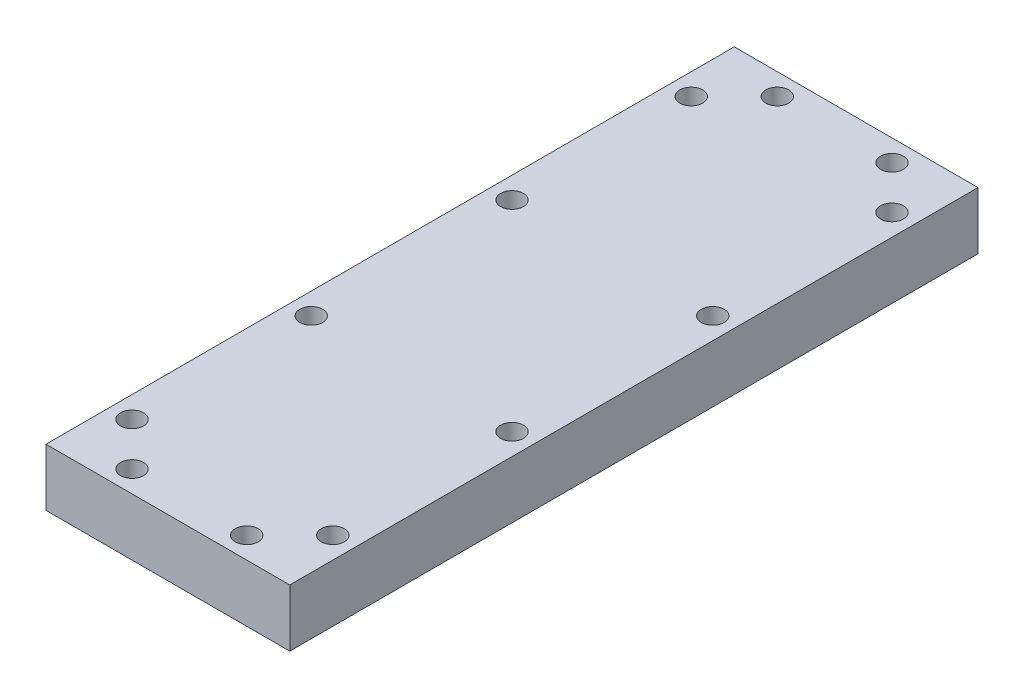
ISO-10303-21;
HEADER;
FILE_DESCRIPTION(('STEP AP214'),'2;1');
FILE_NAME('part.step','',(''),(''),'','','');
FILE_SCHEMA(('AUTOMOTIVE_DESIGN { 1 0 10303 214 1 1 1 1 }'));
ENDSEC;
DATA;
#1=APPLICATION_CONTEXT('core data for automotive mechanical design processes');
#2=APPLICATION_PROTOCOL_DEFINITION('international standard','automotive_design',2000,#1);
#3=PRODUCT_CONTEXT('',#1,'mechanical');
#4=PRODUCT('Part','Part','',(#3));
#5=PRODUCT_RELATED_PRODUCT_CATEGORY('part','',(#4));
#6=PRODUCT_DEFINITION_FORMATION('','',#4);
#7=PRODUCT_DEFINITION_CONTEXT('part definition',#1,'design');
#8=PRODUCT_DEFINITION('design','',#6,#7);
#9=PRODUCT_DEFINITION_SHAPE('','',#8);
#10=(LENGTH_UNIT() NAMED_UNIT(*) SI_UNIT(.MILLI.,.METRE.));
#11=(NAMED_UNIT(*) PLANE_ANGLE_UNIT() SI_UNIT($,.RADIAN.));
#12=(NAMED_UNIT(*) SI_UNIT($,.STERADIAN.) SOLID_ANGLE_UNIT());
#13=UNCERTAINTY_MEASURE_WITH_UNIT(LENGTH_MEASURE(1.E-05),#10,'distance_accuracy_value','');
#14=(GEOMETRIC_REPRESENTATION_CONTEXT(3) GLOBAL_UNCERTAINTY_ASSIGNED_CONTEXT((#13)) GLOBAL_UNIT_ASSIGNED_CONTEXT((#10,
#11,#12)) REPRESENTATION_CONTEXT('',''));
#15=CARTESIAN_POINT('',(0.,0.,0.));
#16=DIRECTION('',(0.,0.,1.));
#17=DIRECTION('',(1.,0.,0.));
#18=AXIS2_PLACEMENT_3D('',#15,#16,#17);
#19=CARTESIAN_POINT('',(-14.,0.,-34.));
#20=DIRECTION('',(0.,1.,0.));
#21=DIRECTION('',(-1.,0.,0.));
#22=AXIS2_PLACEMENT_3D('',#19,#20,#21);
#23=CYLINDRICAL_SURFACE('',#22,1.6);
#24=CARTESIAN_POINT('',(-14.,0.,-34.));
#25=DIRECTION('',(0.,1.,0.));
#26=DIRECTION('',(-1.,0.,0.));
#27=AXIS2_PLACEMENT_3D('',#24,#25,#26);
#28=CIRCLE('',#27,1.6);
#29=CARTESIAN_POINT('',(-12.4,0.,-34.));
#30=VERTEX_POINT('',#29);
#31=EDGE_CURVE('E221',#30,#30,#28,.T.);
#32=ORIENTED_EDGE('',*,*,#31,.F.);
#33=DIRECTION('',(0.,1.,0.));
#34=VECTOR('',#33,1.);
#35=CARTESIAN_POINT('',(-12.4,0.,-34.));
#36=LINE('',#35,#34);
#37=CARTESIAN_POINT('',(-12.4,8.,-34.));
#38=VERTEX_POINT('',#37);
#39=EDGE_CURVE('E11',#30,#38,#36,.T.);
#40=ORIENTED_EDGE('',*,*,#39,.T.);
#41=CARTESIAN_POINT('',(-14.,8.,-34.));
#42=DIRECTION('',(0.,1.,0.));
#43=DIRECTION('',(-1.,0.,0.));
#44=AXIS2_PLACEMENT_3D('',#41,#42,#43);
#45=CIRCLE('',#44,1.6);
#46=EDGE_CURVE('E21',#38,#38,#45,.T.);
#47=ORIENTED_EDGE('',*,*,#46,.T.);
#48=ORIENTED_EDGE('',*,*,#39,.F.);
#49=EDGE_LOOP('',(#32,#40,#47,#48));
#50=FACE_BOUND('',#49,.T.);
#51=ADVANCED_FACE('F17',(#50),#23,.F.);
#52=CARTESIAN_POINT('',(-14.,0.,-9.));
#53=DIRECTION('',(0.,1.,0.));
#54=DIRECTION('',(-1.,0.,0.));
#55=AXIS2_PLACEMENT_3D('',#52,#53,#54);
#56=CYLINDRICAL_SURFACE('',#55,1.6);
#57=CARTESIAN_POINT('',(-14.,0.,-9.));
#58=DIRECTION('',(0.,1.,0.));
#59=DIRECTION('',(-1.,0.,0.));
#60=AXIS2_PLACEMENT_3D('',#57,#58,#59);
#61=CIRCLE('',#60,1.6);
#62=CARTESIAN_POINT('',(-12.4,0.,-9.));
#63=VERTEX_POINT('',#62);
#64=EDGE_CURVE('E217',#63,#63,#61,.T.);
#65=ORIENTED_EDGE('',*,*,#64,.F.);
#66=DIRECTION('',(0.,1.,0.));
#67=VECTOR('',#66,1.);
#68=CARTESIAN_POINT('',(-12.4,0.,-9.));
#69=LINE('',#68,#67);
#70=CARTESIAN_POINT('',(-12.4,8.,-9.));
#71=VERTEX_POINT('',#70);
#72=EDGE_CURVE('E28',#63,#71,#69,.T.);
#73=ORIENTED_EDGE('',*,*,#72,.T.);
#74=CARTESIAN_POINT('',(-14.,8.,-9.));
#75=DIRECTION('',(0.,1.,0.));
#76=DIRECTION('',(-1.,0.,0.));
#77=AXIS2_PLACEMENT_3D('',#74,#75,#76);
#78=CIRCLE('',#77,1.6);
#79=EDGE_CURVE('E269',#71,#71,#78,.T.);
#80=ORIENTED_EDGE('',*,*,#79,.T.);
#81=ORIENTED_EDGE('',*,*,#72,.F.);
#82=EDGE_LOOP('',(#65,#73,#80,#81));
#83=FACE_BOUND('',#82,.T.);
#84=ADVANCED_FACE('F380',(#83),#56,.F.);
#85=CARTESIAN_POINT('',(14.,0.,-34.));
#86=DIRECTION('',(0.,1.,0.));
#87=DIRECTION('',(-1.,0.,0.));
#88=AXIS2_PLACEMENT_3D('',#85,#86,#87);
#89=CYLINDRICAL_SURFACE('',#88,1.6);
#90=CARTESIAN_POINT('',(14.,0.,-34.));
#91=DIRECTION('',(0.,1.,0.));
#92=DIRECTION('',(-1.,0.,0.));
#93=AXIS2_PLACEMENT_3D('',#90,#91,#92);
#94=CIRCLE('',#93,1.6);
#95=CARTESIAN_POINT('',(15.6,0.,-34.));
#96=VERTEX_POINT('',#95);
#97=EDGE_CURVE('E205',#96,#96,#94,.T.);
#98=ORIENTED_EDGE('',*,*,#97,.F.);
#99=DIRECTION('',(0.,1.,0.));
#100=VECTOR('',#99,1.);
#101=CARTESIAN_POINT('',(15.6,0.,-34.));
#102=LINE('',#101,#100);
#103=CARTESIAN_POINT('',(15.6,8.,-34.));
#104=VERTEX_POINT('',#103);
#105=EDGE_CURVE('E240',#96,#104,#102,.T.);
#106=ORIENTED_EDGE('',*,*,#105,.T.);
#107=CARTESIAN_POINT('',(14.,8.,-34.));
#108=DIRECTION('',(0.,1.,0.));
#109=DIRECTION('',(-1.,0.,0.));
#110=AXIS2_PLACEMENT_3D('',#107,#108,#109);
#111=CIRCLE('',#110,1.6);
#112=EDGE_CURVE('E265',#104,#104,#111,.T.);
#113=ORIENTED_EDGE('',*,*,#112,.T.);
#114=ORIENTED_EDGE('',*,*,#105,.F.);
#115=EDGE_LOOP('',(#98,#106,#113,#114));
#116=FACE_BOUND('',#115,.T.);
#117=ADVANCED_FACE('F385',(#116),#89,.F.);
#118=CARTESIAN_POINT('',(14.,0.,-9.));
#119=DIRECTION('',(0.,1.,0.));
#120=DIRECTION('',(-1.,0.,0.));
#121=AXIS2_PLACEMENT_3D('',#118,#119,#120);
#122=CYLINDRICAL_SURFACE('',#121,1.6);
#123=CARTESIAN_POINT('',(14.,0.,-9.));
#124=DIRECTION('',(0.,1.,0.));
#125=DIRECTION('',(-1.,0.,0.));
#126=AXIS2_PLACEMENT_3D('',#123,#124,#125);
#127=CIRCLE('',#126,1.6);
#128=CARTESIAN_POINT('',(15.6,0.,-9.));
#129=VERTEX_POINT('',#128);
#130=EDGE_CURVE('E196',#129,#129,#127,.T.);
#131=ORIENTED_EDGE('',*,*,#130,.F.);
#132=DIRECTION('',(0.,1.,0.));
#133=VECTOR('',#132,1.);
#134=CARTESIAN_POINT('',(15.6,0.,-9.));
#135=LINE('',#134,#133);
#136=CARTESIAN_POINT('',(15.6,8.,-9.));
#137=VERTEX_POINT('',#136);
#138=EDGE_CURVE('E189',#129,#137,#135,.T.);
#139=ORIENTED_EDGE('',*,*,#138,.T.);
#140=CARTESIAN_POINT('',(14.,8.,-9.));
#141=DIRECTION('',(0.,1.,0.));
#142=DIRECTION('',(-1.,0.,0.));
#143=AXIS2_PLACEMENT_3D('',#140,#141,#142);
#144=CIRCLE('',#143,1.6);
#145=EDGE_CURVE('E255',#137,#137,#144,.T.);
#146=ORIENTED_EDGE('',*,*,#145,.T.);
#147=ORIENTED_EDGE('',*,*,#138,.F.);
#148=EDGE_LOOP('',(#131,#139,#146,#147));
#149=FACE_BOUND('',#148,.T.);
#150=ADVANCED_FACE('F395',(#149),#122,.F.);
#151=CARTESIAN_POINT('',(-14.,0.,-62.));
#152=DIRECTION('',(0.,1.,0.));
#153=DIRECTION('',(-1.,0.,0.));
#154=AXIS2_PLACEMENT_3D('',#151,#152,#153);
#155=CYLINDRICAL_SURFACE('',#154,1.6);
#156=CARTESIAN_POINT('',(-14.,0.,-62.));
#157=DIRECTION('',(0.,1.,0.));
#158=DIRECTION('',(-1.,0.,0.));
#159=AXIS2_PLACEMENT_3D('',#156,#157,#158);
#160=CIRCLE('',#159,1.6);
#161=CARTESIAN_POINT('',(-12.4,0.,-62.));
#162=VERTEX_POINT('',#161);
#163=EDGE_CURVE('E185',#162,#162,#160,.T.);
#164=ORIENTED_EDGE('',*,*,#163,.F.);
#165=DIRECTION('',(0.,1.,0.));
#166=VECTOR('',#165,1.);
#167=CARTESIAN_POINT('',(-12.4,0.,-62.));
#168=LINE('',#167,#166);
#169=CARTESIAN_POINT('',(-12.4,8.,-62.));
#170=VERTEX_POINT('',#169);
#171=EDGE_CURVE('E182',#162,#170,#168,.T.);
#172=ORIENTED_EDGE('',*,*,#171,.T.);
#173=CARTESIAN_POINT('',(-14.,8.,-62.));
#174=DIRECTION('',(0.,1.,0.));
#175=DIRECTION('',(-1.,0.,0.));
#176=AXIS2_PLACEMENT_3D('',#173,#174,#175);
#177=CIRCLE('',#176,1.6);
#178=EDGE_CURVE('E187',#170,#170,#177,.T.);
#179=ORIENTED_EDGE('',*,*,#178,.T.);
#180=ORIENTED_EDGE('',*,*,#171,.F.);
#181=EDGE_LOOP('',(#164,#172,#179,#180));
#182=FACE_BOUND('',#181,.T.);
#183=ADVANCED_FACE('F184',(#182),#155,.F.);
#184=CARTESIAN_POINT('',(14.,0.,-62.));
#185=DIRECTION('',(0.,1.,0.));
#186=DIRECTION('',(-1.,0.,0.));
#187=AXIS2_PLACEMENT_3D('',#184,#185,#186);
#188=CYLINDRICAL_SURFACE('',#187,1.6);
#189=CARTESIAN_POINT('',(14.,0.,-62.));
#190=DIRECTION('',(0.,1.,0.));
#191=DIRECTION('',(-1.,0.,0.));
#192=AXIS2_PLACEMENT_3D('',#189,#190,#191);
#193=CIRCLE('',#192,1.6);
#194=CARTESIAN_POINT('',(15.6,0.,-62.));
#195=VERTEX_POINT('',#194);
#196=EDGE_CURVE('E197',#195,#195,#193,.T.);
#197=ORIENTED_EDGE('',*,*,#196,.F.);
#198=DIRECTION('',(0.,1.,0.));
#199=VECTOR('',#198,1.);
#200=CARTESIAN_POINT('',(15.6,0.,-62.));
#201=LINE('',#200,#199);
#202=CARTESIAN_POINT('',(15.6,8.,-62.));
#203=VERTEX_POINT('',#202);
#204=EDGE_CURVE('E190',#195,#203,#201,.T.);
#205=ORIENTED_EDGE('',*,*,#204,.T.);
#206=CARTESIAN_POINT('',(14.,8.,-62.));
#207=DIRECTION('',(0.,1.,0.));
#208=DIRECTION('',(-1.,0.,0.));
#209=AXIS2_PLACEMENT_3D('',#206,#207,#208);
#210=CIRCLE('',#209,1.6);
#211=EDGE_CURVE('E226',#203,#203,#210,.T.);
#212=ORIENTED_EDGE('',*,*,#211,.T.);
#213=ORIENTED_EDGE('',*,*,#204,.F.);
#214=EDGE_LOOP('',(#197,#205,#212,#213));
#215=FACE_BOUND('',#214,.T.);
#216=ADVANCED_FACE('F394',(#215),#188,.F.);
#217=CARTESIAN_POINT('',(-14.,0.,-87.));
#218=DIRECTION('',(0.,1.,0.));
#219=DIRECTION('',(-1.,0.,0.));
#220=AXIS2_PLACEMENT_3D('',#217,#218,#219);
#221=CYLINDRICAL_SURFACE('',#220,1.6);
#222=CARTESIAN_POINT('',(-14.,0.,-87.));
#223=DIRECTION('',(0.,1.,0.));
#224=DIRECTION('',(-1.,0.,0.));
#225=AXIS2_PLACEMENT_3D('',#222,#223,#224);
#226=CIRCLE('',#225,1.6);
#227=CARTESIAN_POINT('',(-12.4,0.,-87.));
#228=VERTEX_POINT('',#227);
#229=EDGE_CURVE('E208',#228,#228,#226,.T.);
#230=ORIENTED_EDGE('',*,*,#229,.F.);
#231=DIRECTION('',(0.,1.,0.));
#232=VECTOR('',#231,1.);
#233=CARTESIAN_POINT('',(-12.4,0.,-87.));
#234=LINE('',#233,#232);
#235=CARTESIAN_POINT('',(-12.4,8.,-87.));
#236=VERTEX_POINT('',#235);
#237=EDGE_CURVE('E228',#228,#236,#234,.T.);
#238=ORIENTED_EDGE('',*,*,#237,.T.);
#239=CARTESIAN_POINT('',(-14.,8.,-87.));
#240=DIRECTION('',(0.,1.,0.));
#241=DIRECTION('',(-1.,0.,0.));
#242=AXIS2_PLACEMENT_3D('',#239,#240,#241);
#243=CIRCLE('',#242,1.6);
#244=EDGE_CURVE('E222',#236,#236,#243,.T.);
#245=ORIENTED_EDGE('',*,*,#244,.T.);
#246=ORIENTED_EDGE('',*,*,#237,.F.);
#247=EDGE_LOOP('',(#230,#238,#245,#246));
#248=FACE_BOUND('',#247,.T.);
#249=ADVANCED_FACE('F403',(#248),#221,.F.);
#250=CARTESIAN_POINT('',(14.,0.,-87.));
#251=DIRECTION('',(0.,1.,0.));
#252=DIRECTION('',(-1.,0.,0.));
#253=AXIS2_PLACEMENT_3D('',#250,#251,#252);
#254=CYLINDRICAL_SURFACE('',#253,1.6);
#255=CARTESIAN_POINT('',(14.,0.,-87.));
#256=DIRECTION('',(0.,1.,0.));
#257=DIRECTION('',(-1.,0.,0.));
#258=AXIS2_PLACEMENT_3D('',#255,#256,#257);
#259=CIRCLE('',#258,1.6);
#260=CARTESIAN_POINT('',(15.6,0.,-87.));
#261=VERTEX_POINT('',#260);
#262=EDGE_CURVE('E252',#261,#261,#259,.T.);
#263=ORIENTED_EDGE('',*,*,#262,.F.);
#264=DIRECTION('',(0.,1.,0.));
#265=VECTOR('',#264,1.);
#266=CARTESIAN_POINT('',(15.6,0.,-87.));
#267=LINE('',#266,#265);
#268=CARTESIAN_POINT('',(15.6,8.,-87.));
#269=VERTEX_POINT('',#268);
#270=EDGE_CURVE('E230',#261,#269,#267,.T.);
#271=ORIENTED_EDGE('',*,*,#270,.T.);
#272=CARTESIAN_POINT('',(14.,8.,-87.));
#273=DIRECTION('',(0.,1.,0.));
#274=DIRECTION('',(-1.,0.,0.));
#275=AXIS2_PLACEMENT_3D('',#272,#273,#274);
#276=CIRCLE('',#275,1.6);
#277=EDGE_CURVE('E227',#269,#269,#276,.T.);
#278=ORIENTED_EDGE('',*,*,#277,.T.);
#279=ORIENTED_EDGE('',*,*,#270,.F.);
#280=EDGE_LOOP('',(#263,#271,#278,#279));
#281=FACE_BOUND('',#280,.T.);
#282=ADVANCED_FACE('F414',(#281),#254,.F.);
#283=CARTESIAN_POINT('',(-8.,0.,-3.));
#284=DIRECTION('',(0.,1.,0.));
#285=DIRECTION('',(-1.,0.,0.));
#286=AXIS2_PLACEMENT_3D('',#283,#284,#285);
#287=CYLINDRICAL_SURFACE('',#286,1.6);
#288=CARTESIAN_POINT('',(-8.,0.,-3.));
#289=DIRECTION('',(0.,1.,0.));
#290=DIRECTION('',(-1.,0.,0.));
#291=AXIS2_PLACEMENT_3D('',#288,#289,#290);
#292=CIRCLE('',#291,1.6);
#293=CARTESIAN_POINT('',(-6.4,0.,-3.));
#294=VERTEX_POINT('',#293);
#295=EDGE_CURVE('E296',#294,#294,#292,.T.);
#296=ORIENTED_EDGE('',*,*,#295,.F.);
#297=DIRECTION('',(0.,1.,0.));
#298=VECTOR('',#297,1.);
#299=CARTESIAN_POINT('',(-6.4,0.,-3.));
#300=LINE('',#299,#298);
#301=CARTESIAN_POINT('',(-6.4,8.,-3.));
#302=VERTEX_POINT('',#301);
#303=EDGE_CURVE('E85',#294,#302,#300,.T.);
#304=ORIENTED_EDGE('',*,*,#303,.T.);
#305=CARTESIAN_POINT('',(-8.,8.,-3.));
#306=DIRECTION('',(0.,1.,0.));
#307=DIRECTION('',(-1.,0.,0.));
#308=AXIS2_PLACEMENT_3D('',#305,#306,#307);
#309=CIRCLE('',#308,1.6);
#310=EDGE_CURVE('E318',#302,#302,#309,.T.);
#311=ORIENTED_EDGE('',*,*,#310,.T.);
#312=ORIENTED_EDGE('',*,*,#303,.F.);
#313=EDGE_LOOP('',(#296,#304,#311,#312));
#314=FACE_BOUND('',#313,.T.);
#315=ADVANCED_FACE('F417',(#314),#287,.F.);
#316=CARTESIAN_POINT('',(8.,0.,-3.));
#317=DIRECTION('',(0.,1.,0.));
#318=DIRECTION('',(-1.,0.,0.));
#319=AXIS2_PLACEMENT_3D('',#316,#317,#318);
#320=CYLINDRICAL_SURFACE('',#319,1.6);
#321=CARTESIAN_POINT('',(8.,0.,-3.));
#322=DIRECTION('',(0.,1.,0.));
#323=DIRECTION('',(-1.,0.,0.));
#324=AXIS2_PLACEMENT_3D('',#321,#322,#323);
#325=CIRCLE('',#324,1.6);
#326=CARTESIAN_POINT('',(9.6,0.,-3.));
#327=VERTEX_POINT('',#326);
#328=EDGE_CURVE('E310',#327,#327,#325,.T.);
#329=ORIENTED_EDGE('',*,*,#328,.F.);
#330=DIRECTION('',(0.,1.,0.));
#331=VECTOR('',#330,1.);
#332=CARTESIAN_POINT('',(9.6,0.,-3.));
#333=LINE('',#332,#331);
#334=CARTESIAN_POINT('',(9.6,8.,-3.));
#335=VERTEX_POINT('',#334);
#336=EDGE_CURVE('E99',#327,#335,#333,.T.);
#337=ORIENTED_EDGE('',*,*,#336,.T.);
#338=CARTESIAN_POINT('',(8.,8.,-3.));
#339=DIRECTION('',(0.,1.,0.));
#340=DIRECTION('',(-1.,0.,0.));
#341=AXIS2_PLACEMENT_3D('',#338,#339,#340);
#342=CIRCLE('',#341,1.6);
#343=EDGE_CURVE('E302',#335,#335,#342,.T.);
#344=ORIENTED_EDGE('',*,*,#343,.T.);
#345=ORIENTED_EDGE('',*,*,#336,.F.);
#346=EDGE_LOOP('',(#329,#337,#344,#345));
#347=FACE_BOUND('',#346,.T.);
#348=ADVANCED_FACE('F19',(#347),#320,.F.);
#349=CARTESIAN_POINT('',(-8.,0.,-93.));
#350=DIRECTION('',(0.,1.,0.));
#351=DIRECTION('',(-1.,0.,0.));
#352=AXIS2_PLACEMENT_3D('',#349,#350,#351);
#353=CYLINDRICAL_SURFACE('',#352,1.6);
#354=CARTESIAN_POINT('',(-8.,0.,-93.));
#355=DIRECTION('',(0.,1.,0.));
#356=DIRECTION('',(-1.,0.,0.));
#357=AXIS2_PLACEMENT_3D('',#354,#355,#356);
#358=CIRCLE('',#357,1.6);
#359=CARTESIAN_POINT('',(-6.4,0.,-93.));
#360=VERTEX_POINT('',#359);
#361=EDGE_CURVE('E293',#360,#360,#358,.T.);
#362=ORIENTED_EDGE('',*,*,#361,.F.);
#363=DIRECTION('',(0.,1.,0.));
#364=VECTOR('',#363,1.);
#365=CARTESIAN_POINT('',(-6.4,0.,-93.));
#366=LINE('',#365,#364);
#367=CARTESIAN_POINT('',(-6.4,8.,-93.));
#368=VERTEX_POINT('',#367);
#369=EDGE_CURVE('E216',#360,#368,#366,.T.);
#370=ORIENTED_EDGE('',*,*,#369,.T.);
#371=CARTESIAN_POINT('',(-8.,8.,-93.));
#372=DIRECTION('',(0.,1.,0.));
#373=DIRECTION('',(-1.,0.,0.));
#374=AXIS2_PLACEMENT_3D('',#371,#372,#373);
#375=CIRCLE('',#374,1.6);
#376=EDGE_CURVE('E298',#368,#368,#375,.T.);
#377=ORIENTED_EDGE('',*,*,#376,.T.);
#378=ORIENTED_EDGE('',*,*,#369,.F.);
#379=EDGE_LOOP('',(#362,#370,#377,#378));
#380=FACE_BOUND('',#379,.T.);
#381=ADVANCED_FACE('F390',(#380),#353,.F.);
#382=CARTESIAN_POINT('',(8.,0.,-93.));
#383=DIRECTION('',(0.,1.,0.));
#384=DIRECTION('',(-1.,0.,0.));
#385=AXIS2_PLACEMENT_3D('',#382,#383,#384);
#386=CYLINDRICAL_SURFACE('',#385,1.6);
#387=CARTESIAN_POINT('',(8.,0.,-93.));
#388=DIRECTION('',(0.,1.,0.));
#389=DIRECTION('',(-1.,0.,0.));
#390=AXIS2_PLACEMENT_3D('',#387,#388,#389);
#391=CIRCLE('',#390,1.6);
#392=CARTESIAN_POINT('',(9.6,0.,-93.));
#393=VERTEX_POINT('',#392);
#394=EDGE_CURVE('E289',#393,#393,#391,.T.);
#395=ORIENTED_EDGE('',*,*,#394,.F.);
#396=DIRECTION('',(0.,1.,0.));
#397=VECTOR('',#396,1.);
#398=CARTESIAN_POINT('',(9.6,0.,-93.));
#399=LINE('',#398,#397);
#400=CARTESIAN_POINT('',(9.6,8.,-93.));
#401=VERTEX_POINT('',#400);
#402=EDGE_CURVE('E260',#393,#401,#399,.T.);
#403=ORIENTED_EDGE('',*,*,#402,.T.);
#404=CARTESIAN_POINT('',(8.,8.,-93.));
#405=DIRECTION('',(0.,1.,0.));
#406=DIRECTION('',(-1.,0.,0.));
#407=AXIS2_PLACEMENT_3D('',#404,#405,#406);
#408=CIRCLE('',#407,1.6);
#409=EDGE_CURVE('E303',#401,#401,#408,.T.);
#410=ORIENTED_EDGE('',*,*,#409,.T.);
#411=ORIENTED_EDGE('',*,*,#402,.F.);
#412=EDGE_LOOP('',(#395,#403,#410,#411));
#413=FACE_BOUND('',#412,.T.);
#414=ADVANCED_FACE('F357',(#413),#386,.F.);
#415=CARTESIAN_POINT('',(0.,8.,0.));
#416=DIRECTION('',(0.,1.,0.));
#417=DIRECTION('',(1.,0.,0.));
#418=AXIS2_PLACEMENT_3D('',#415,#416,#417);
#419=PLANE('',#418);
#420=ORIENTED_EDGE('',*,*,#46,.F.);
#421=EDGE_LOOP('',(#420));
#422=FACE_BOUND('',#421,.T.);
#423=ORIENTED_EDGE('',*,*,#79,.F.);
#424=EDGE_LOOP('',(#423));
#425=FACE_BOUND('',#424,.T.);
#426=ORIENTED_EDGE('',*,*,#112,.F.);
#427=EDGE_LOOP('',(#426));
#428=FACE_BOUND('',#427,.T.);
#429=ORIENTED_EDGE('',*,*,#145,.F.);
#430=EDGE_LOOP('',(#429));
#431=FACE_BOUND('',#430,.T.);
#432=ORIENTED_EDGE('',*,*,#178,.F.);
#433=EDGE_LOOP('',(#432));
#434=FACE_BOUND('',#433,.T.);
#435=ORIENTED_EDGE('',*,*,#211,.F.);
#436=EDGE_LOOP('',(#435));
#437=FACE_BOUND('',#436,.T.);
#438=ORIENTED_EDGE('',*,*,#244,.F.);
#439=EDGE_LOOP('',(#438));
#440=FACE_BOUND('',#439,.T.);
#441=ORIENTED_EDGE('',*,*,#277,.F.);
#442=EDGE_LOOP('',(#441));
#443=FACE_BOUND('',#442,.T.);
#444=ORIENTED_EDGE('',*,*,#310,.F.);
#445=EDGE_LOOP('',(#444));
#446=FACE_BOUND('',#445,.T.);
#447=ORIENTED_EDGE('',*,*,#343,.F.);
#448=EDGE_LOOP('',(#447));
#449=FACE_BOUND('',#448,.T.);
#450=ORIENTED_EDGE('',*,*,#376,.F.);
#451=EDGE_LOOP('',(#450));
#452=FACE_BOUND('',#451,.T.);
#453=ORIENTED_EDGE('',*,*,#409,.F.);
#454=EDGE_LOOP('',(#453));
#455=FACE_BOUND('',#454,.T.);
#456=DIRECTION('',(0.,0.,1.));
#457=VECTOR('',#456,1.);
#458=CARTESIAN_POINT('',(-17.,8.,-96.));
#459=LINE('',#458,#457);
#460=CARTESIAN_POINT('',(-17.,8.,-96.));
#461=VERTEX_POINT('',#460);
#462=CARTESIAN_POINT('',(-17.,8.,0.));
#463=VERTEX_POINT('',#462);
#464=EDGE_CURVE('E243',#461,#463,#459,.T.);
#465=ORIENTED_EDGE('',*,*,#464,.T.);
#466=DIRECTION('',(1.,0.,0.));
#467=VECTOR('',#466,1.);
#468=CARTESIAN_POINT('',(-17.,8.,0.));
#469=LINE('',#468,#467);
#470=CARTESIAN_POINT('',(17.,8.,0.));
#471=VERTEX_POINT('',#470);
#472=EDGE_CURVE('E236',#463,#471,#469,.T.);
#473=ORIENTED_EDGE('',*,*,#472,.T.);
#474=DIRECTION('',(0.,0.,-1.));
#475=VECTOR('',#474,1.);
#476=CARTESIAN_POINT('',(17.,8.,0.));
#477=LINE('',#476,#475);
#478=CARTESIAN_POINT('',(17.,8.,-96.));
#479=VERTEX_POINT('',#478);
#480=EDGE_CURVE('E237',#471,#479,#477,.T.);
#481=ORIENTED_EDGE('',*,*,#480,.T.);
#482=DIRECTION('',(-1.,0.,0.));
#483=VECTOR('',#482,1.);
#484=CARTESIAN_POINT('',(17.,8.,-96.));
#485=LINE('',#484,#483);
#486=EDGE_CURVE('E244',#479,#461,#485,.T.);
#487=ORIENTED_EDGE('',*,*,#486,.T.);
#488=EDGE_LOOP('',(#465,#473,#481,#487));
#489=FACE_BOUND('',#488,.T.);
#490=ADVANCED_FACE('F359',(#422,#425,#428,#431,#434,#437,#440,#443,#446,#449,#452,#455,#489),
#419,.T.);
#491=CARTESIAN_POINT('',(-17.,0.,0.));
#492=DIRECTION('',(0.,0.,1.));
#493=DIRECTION('',(1.,0.,0.));
#494=AXIS2_PLACEMENT_3D('',#491,#492,#493);
#495=PLANE('',#494);
#496=DIRECTION('',(1.,0.,0.));
#497=VECTOR('',#496,1.);
#498=CARTESIAN_POINT('',(-17.,0.,0.));
#499=LINE('',#498,#497);
#500=CARTESIAN_POINT('',(-17.,0.,0.));
#501=VERTEX_POINT('',#500);
#502=CARTESIAN_POINT('',(17.,0.,0.));
#503=VERTEX_POINT('',#502);
#504=EDGE_CURVE('E212',#501,#503,#499,.T.);
#505=ORIENTED_EDGE('',*,*,#504,.T.);
#506=DIRECTION('',(0.,1.,0.));
#507=VECTOR('',#506,1.);
#508=CARTESIAN_POINT('',(17.,0.,0.));
#509=LINE('',#508,#507);
#510=EDGE_CURVE('E232',#503,#471,#509,.T.);
#511=ORIENTED_EDGE('',*,*,#510,.T.);
#512=ORIENTED_EDGE('',*,*,#472,.F.);
#513=DIRECTION('',(0.,1.,0.));
#514=VECTOR('',#513,1.);
#515=CARTESIAN_POINT('',(-17.,0.,0.));
#516=LINE('',#515,#514);
#517=EDGE_CURVE('E149',#501,#463,#516,.T.);
#518=ORIENTED_EDGE('',*,*,#517,.F.);
#519=EDGE_LOOP('',(#505,#511,#512,#518));
#520=FACE_BOUND('',#519,.T.);
#521=ADVANCED_FACE('F362',(#520),#495,.T.);
#522=CARTESIAN_POINT('',(17.,0.,0.));
#523=DIRECTION('',(1.,0.,0.));
#524=DIRECTION('',(0.,1.,0.));
#525=AXIS2_PLACEMENT_3D('',#522,#523,#524);
#526=PLANE('',#525);
#527=DIRECTION('',(0.,0.,-1.));
#528=VECTOR('',#527,1.);
#529=CARTESIAN_POINT('',(17.,0.,0.));
#530=LINE('',#529,#528);
#531=CARTESIAN_POINT('',(17.,0.,-96.));
#532=VERTEX_POINT('',#531);
#533=EDGE_CURVE('E274',#503,#532,#530,.T.);
#534=ORIENTED_EDGE('',*,*,#533,.T.);
#535=DIRECTION('',(0.,1.,0.));
#536=VECTOR('',#535,1.);
#537=CARTESIAN_POINT('',(17.,0.,-96.));
#538=LINE('',#537,#536);
#539=EDGE_CURVE('E248',#532,#479,#538,.T.);
#540=ORIENTED_EDGE('',*,*,#539,.T.);
#541=ORIENTED_EDGE('',*,*,#480,.F.);
#542=ORIENTED_EDGE('',*,*,#510,.F.);
#543=EDGE_LOOP('',(#534,#540,#541,#542));
#544=FACE_BOUND('',#543,.T.);
#545=ADVANCED_FACE('F376',(#544),#526,.T.);
#546=CARTESIAN_POINT('',(17.,0.,-96.));
#547=DIRECTION('',(0.,0.,-1.));
#548=DIRECTION('',(0.,-1.,0.));
#549=AXIS2_PLACEMENT_3D('',#546,#547,#548);
#550=PLANE('',#549);
#551=DIRECTION('',(-1.,0.,0.));
#552=VECTOR('',#551,1.);
#553=CARTESIAN_POINT('',(17.,0.,-96.));
#554=LINE('',#553,#552);
#555=CARTESIAN_POINT('',(-17.,0.,-96.));
#556=VERTEX_POINT('',#555);
#557=EDGE_CURVE('E272',#532,#556,#554,.T.);
#558=ORIENTED_EDGE('',*,*,#557,.T.);
#559=DIRECTION('',(0.,1.,0.));
#560=VECTOR('',#559,1.);
#561=CARTESIAN_POINT('',(-17.,0.,-96.));
#562=LINE('',#561,#560);
#563=EDGE_CURVE('E138',#556,#461,#562,.T.);
#564=ORIENTED_EDGE('',*,*,#563,.T.);
#565=ORIENTED_EDGE('',*,*,#486,.F.);
#566=ORIENTED_EDGE('',*,*,#539,.F.);
#567=EDGE_LOOP('',(#558,#564,#565,#566));
#568=FACE_BOUND('',#567,.T.);
#569=ADVANCED_FACE('F368',(#568),#550,.T.);
#570=CARTESIAN_POINT('',(-17.,0.,-96.));
#571=DIRECTION('',(-1.,0.,0.));
#572=DIRECTION('',(0.,0.,1.));
#573=AXIS2_PLACEMENT_3D('',#570,#571,#572);
#574=PLANE('',#573);
#575=DIRECTION('',(0.,0.,1.));
#576=VECTOR('',#575,1.);
#577=CARTESIAN_POINT('',(-17.,0.,-96.));
#578=LINE('',#577,#576);
#579=EDGE_CURVE('E275',#556,#501,#578,.T.);
#580=ORIENTED_EDGE('',*,*,#579,.T.);
#581=ORIENTED_EDGE('',*,*,#517,.T.);
#582=ORIENTED_EDGE('',*,*,#464,.F.);
#583=ORIENTED_EDGE('',*,*,#563,.F.);
#584=EDGE_LOOP('',(#580,#581,#582,#583));
#585=FACE_BOUND('',#584,.T.);
#586=ADVANCED_FACE('F366',(#585),#574,.T.);
#587=CARTESIAN_POINT('',(0.,0.,0.));
#588=DIRECTION('',(0.,1.,0.));
#589=DIRECTION('',(1.,0.,0.));
#590=AXIS2_PLACEMENT_3D('',#587,#588,#589);
#591=PLANE('',#590);
#592=ORIENTED_EDGE('',*,*,#31,.T.);
#593=EDGE_LOOP('',(#592));
#594=FACE_BOUND('',#593,.T.);
#595=ORIENTED_EDGE('',*,*,#64,.T.);
#596=EDGE_LOOP('',(#595));
#597=FACE_BOUND('',#596,.T.);
#598=ORIENTED_EDGE('',*,*,#97,.T.);
#599=EDGE_LOOP('',(#598));
#600=FACE_BOUND('',#599,.T.);
#601=ORIENTED_EDGE('',*,*,#130,.T.);
#602=EDGE_LOOP('',(#601));
#603=FACE_BOUND('',#602,.T.);
#604=ORIENTED_EDGE('',*,*,#163,.T.);
#605=EDGE_LOOP('',(#604));
#606=FACE_BOUND('',#605,.T.);
#607=ORIENTED_EDGE('',*,*,#196,.T.);
#608=EDGE_LOOP('',(#607));
#609=FACE_BOUND('',#608,.T.);
#610=ORIENTED_EDGE('',*,*,#229,.T.);
#611=EDGE_LOOP('',(#610));
#612=FACE_BOUND('',#611,.T.);
#613=ORIENTED_EDGE('',*,*,#262,.T.);
#614=EDGE_LOOP('',(#613));
#615=FACE_BOUND('',#614,.T.);
#616=ORIENTED_EDGE('',*,*,#295,.T.);
#617=EDGE_LOOP('',(#616));
#618=FACE_BOUND('',#617,.T.);
#619=ORIENTED_EDGE('',*,*,#328,.T.);
#620=EDGE_LOOP('',(#619));
#621=FACE_BOUND('',#620,.T.);
#622=ORIENTED_EDGE('',*,*,#361,.T.);
#623=EDGE_LOOP('',(#622));
#624=FACE_BOUND('',#623,.T.);
#625=ORIENTED_EDGE('',*,*,#394,.T.);
#626=EDGE_LOOP('',(#625));
#627=FACE_BOUND('',#626,.T.);
#628=ORIENTED_EDGE('',*,*,#579,.F.);
#629=ORIENTED_EDGE('',*,*,#557,.F.);
#630=ORIENTED_EDGE('',*,*,#533,.F.);
#631=ORIENTED_EDGE('',*,*,#504,.F.);
#632=EDGE_LOOP('',(#628,#629,#630,#631));
#633=FACE_BOUND('',#632,.T.);
#634=ADVANCED_FACE('F193',(#594,#597,#600,#603,#606,#609,#612,#615,#618,#621,#624,#627,#633),
#591,.F.);
#635=CLOSED_SHELL('',(#51,#84,#117,#150,#183,#216,#249,#282,#315,#348,#381,#414,#490,#521,#545,
#569,#586,#634));
#636=MANIFOLD_SOLID_BREP('B1',#635);
#637=ADVANCED_BREP_SHAPE_REPRESENTATION('',(#18,#636),#14);
#638=SHAPE_DEFINITION_REPRESENTATION(#9,#637);
ENDSEC;
END-ISO-10303-21;
